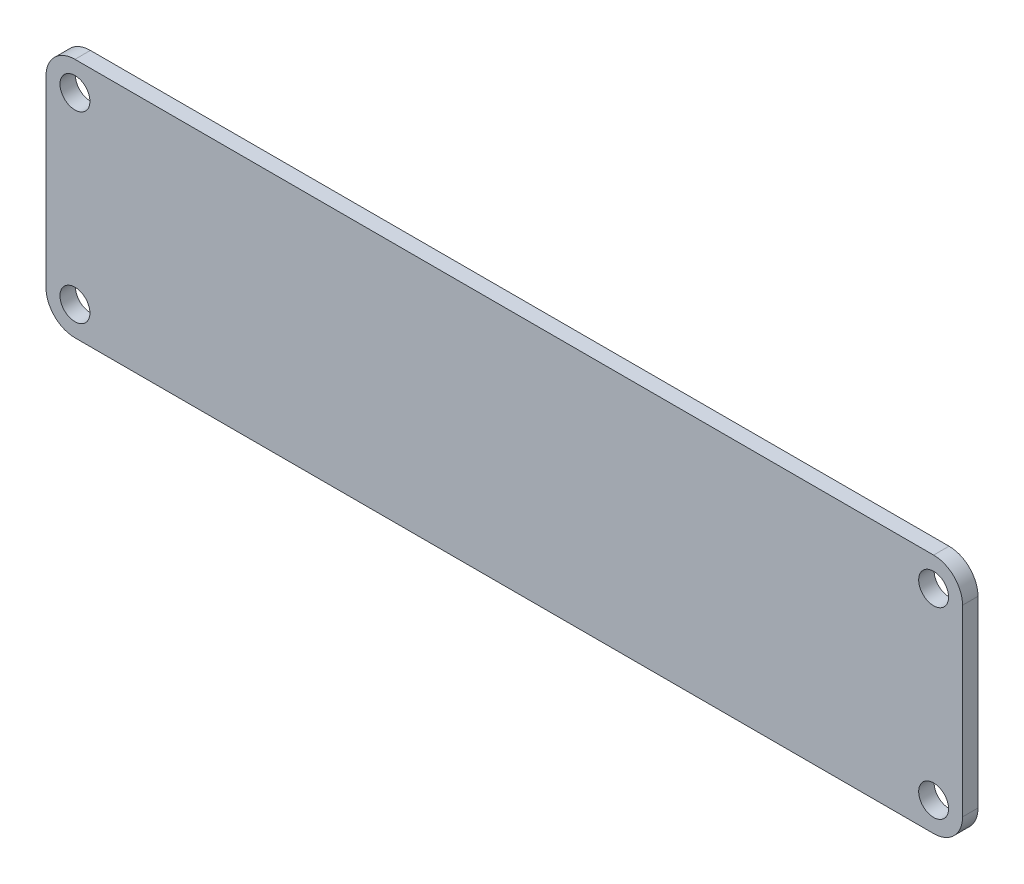
ISO-10303-21;
HEADER;
FILE_DESCRIPTION(('STEP AP214'),'2;1');
FILE_NAME('part.step','',(''),(''),'','','');
FILE_SCHEMA(('AUTOMOTIVE_DESIGN { 1 0 10303 214 1 1 1 1 }'));
ENDSEC;
DATA;
#1=APPLICATION_CONTEXT('core data for automotive mechanical design processes');
#2=APPLICATION_PROTOCOL_DEFINITION('international standard','automotive_design',2000,#1);
#3=PRODUCT_CONTEXT('',#1,'mechanical');
#4=PRODUCT('Part','Part','',(#3));
#5=PRODUCT_RELATED_PRODUCT_CATEGORY('part','',(#4));
#6=PRODUCT_DEFINITION_FORMATION('','',#4);
#7=PRODUCT_DEFINITION_CONTEXT('part definition',#1,'design');
#8=PRODUCT_DEFINITION('design','',#6,#7);
#9=PRODUCT_DEFINITION_SHAPE('','',#8);
#10=(LENGTH_UNIT() NAMED_UNIT(*) SI_UNIT(.MILLI.,.METRE.));
#11=(NAMED_UNIT(*) PLANE_ANGLE_UNIT() SI_UNIT($,.RADIAN.));
#12=(NAMED_UNIT(*) SI_UNIT($,.STERADIAN.) SOLID_ANGLE_UNIT());
#13=UNCERTAINTY_MEASURE_WITH_UNIT(LENGTH_MEASURE(1.E-05),#10,'distance_accuracy_value','');
#14=(GEOMETRIC_REPRESENTATION_CONTEXT(3) GLOBAL_UNCERTAINTY_ASSIGNED_CONTEXT((#13)) GLOBAL_UNIT_ASSIGNED_CONTEXT((#10,
#11,#12)) REPRESENTATION_CONTEXT('',''));
#15=CARTESIAN_POINT('',(0.,0.,0.));
#16=DIRECTION('',(0.,0.,1.));
#17=DIRECTION('',(1.,0.,0.));
#18=AXIS2_PLACEMENT_3D('',#15,#16,#17);
#19=CARTESIAN_POINT('',(44.5,-9.5,1.6));
#20=DIRECTION('',(0.,0.,1.));
#21=DIRECTION('',(1.,0.,0.));
#22=AXIS2_PLACEMENT_3D('',#19,#20,#21);
#23=PLANE('',#22);
#24=CARTESIAN_POINT('',(44.5,-9.5,1.6));
#25=DIRECTION('',(0.,0.,1.));
#26=DIRECTION('',(1.,0.,0.));
#27=AXIS2_PLACEMENT_3D('',#24,#25,#26);
#28=CIRCLE('',#27,1.55);
#29=CARTESIAN_POINT('',(46.05,-9.5,1.6));
#30=VERTEX_POINT('',#29);
#31=EDGE_CURVE('E191',#30,#30,#28,.T.);
#32=ORIENTED_EDGE('',*,*,#31,.F.);
#33=EDGE_LOOP('',(#32));
#34=FACE_BOUND('',#33,.T.);
#35=CARTESIAN_POINT('',(-44.5,9.5,1.6));
#36=DIRECTION('',(0.,0.,1.));
#37=DIRECTION('',(1.,0.,0.));
#38=AXIS2_PLACEMENT_3D('',#35,#36,#37);
#39=CIRCLE('',#38,1.55);
#40=CARTESIAN_POINT('',(-42.95,9.5,1.6));
#41=VERTEX_POINT('',#40);
#42=EDGE_CURVE('E137',#41,#41,#39,.T.);
#43=ORIENTED_EDGE('',*,*,#42,.F.);
#44=EDGE_LOOP('',(#43));
#45=FACE_BOUND('',#44,.T.);
#46=CARTESIAN_POINT('',(44.5,-9.5,1.6));
#47=DIRECTION('',(0.,0.,1.));
#48=DIRECTION('',(1.,0.,0.));
#49=AXIS2_PLACEMENT_3D('',#46,#47,#48);
#50=CIRCLE('',#49,3.);
#51=CARTESIAN_POINT('',(44.5,-12.5,1.6));
#52=VERTEX_POINT('',#51);
#53=CARTESIAN_POINT('',(47.5,-9.5,1.6));
#54=VERTEX_POINT('',#53);
#55=EDGE_CURVE('E148',#52,#54,#50,.T.);
#56=ORIENTED_EDGE('',*,*,#55,.T.);
#57=DIRECTION('',(0.,1.,0.));
#58=VECTOR('',#57,1.);
#59=CARTESIAN_POINT('',(47.5,9.5,1.6));
#60=LINE('',#59,#58);
#61=CARTESIAN_POINT('',(47.5,9.5,1.6));
#62=VERTEX_POINT('',#61);
#63=EDGE_CURVE('E96',#54,#62,#60,.T.);
#64=ORIENTED_EDGE('',*,*,#63,.T.);
#65=CARTESIAN_POINT('',(44.5,9.5,1.6));
#66=DIRECTION('',(0.,0.,1.));
#67=DIRECTION('',(-1.,0.,0.));
#68=AXIS2_PLACEMENT_3D('',#65,#66,#67);
#69=CIRCLE('',#68,3.);
#70=CARTESIAN_POINT('',(44.5,12.5,1.6));
#71=VERTEX_POINT('',#70);
#72=EDGE_CURVE('E163',#62,#71,#69,.T.);
#73=ORIENTED_EDGE('',*,*,#72,.T.);
#74=DIRECTION('',(-1.,0.,0.));
#75=VECTOR('',#74,1.);
#76=CARTESIAN_POINT('',(-44.5,12.5,1.6));
#77=LINE('',#76,#75);
#78=CARTESIAN_POINT('',(-44.5,12.5,1.6));
#79=VERTEX_POINT('',#78);
#80=EDGE_CURVE('E176',#71,#79,#77,.T.);
#81=ORIENTED_EDGE('',*,*,#80,.T.);
#82=CARTESIAN_POINT('',(-44.5,9.5,1.6));
#83=DIRECTION('',(0.,0.,1.));
#84=DIRECTION('',(1.,0.,0.));
#85=AXIS2_PLACEMENT_3D('',#82,#83,#84);
#86=CIRCLE('',#85,3.);
#87=CARTESIAN_POINT('',(-47.5,9.5,1.6));
#88=VERTEX_POINT('',#87);
#89=EDGE_CURVE('E115',#79,#88,#86,.T.);
#90=ORIENTED_EDGE('',*,*,#89,.T.);
#91=DIRECTION('',(0.,-1.,0.));
#92=VECTOR('',#91,1.);
#93=CARTESIAN_POINT('',(-47.5,9.5,1.6));
#94=LINE('',#93,#92);
#95=CARTESIAN_POINT('',(-47.5,-9.5,1.6));
#96=VERTEX_POINT('',#95);
#97=EDGE_CURVE('E109',#88,#96,#94,.T.);
#98=ORIENTED_EDGE('',*,*,#97,.T.);
#99=CARTESIAN_POINT('',(-44.5,-9.5,1.6));
#100=DIRECTION('',(0.,0.,1.));
#101=DIRECTION('',(1.,0.,0.));
#102=AXIS2_PLACEMENT_3D('',#99,#100,#101);
#103=CIRCLE('',#102,3.);
#104=CARTESIAN_POINT('',(-44.5,-12.5,1.6));
#105=VERTEX_POINT('',#104);
#106=EDGE_CURVE('E113',#96,#105,#103,.T.);
#107=ORIENTED_EDGE('',*,*,#106,.T.);
#108=DIRECTION('',(1.,0.,0.));
#109=VECTOR('',#108,1.);
#110=CARTESIAN_POINT('',(-44.5,-12.5,1.6));
#111=LINE('',#110,#109);
#112=EDGE_CURVE('E53',#105,#52,#111,.T.);
#113=ORIENTED_EDGE('',*,*,#112,.T.);
#114=EDGE_LOOP('',(#56,#64,#73,#81,#90,#98,#107,#113));
#115=FACE_BOUND('',#114,.T.);
#116=CARTESIAN_POINT('',(-44.5,-9.5,1.6));
#117=DIRECTION('',(0.,0.,1.));
#118=DIRECTION('',(1.,0.,0.));
#119=AXIS2_PLACEMENT_3D('',#116,#117,#118);
#120=CIRCLE('',#119,1.55);
#121=CARTESIAN_POINT('',(-42.95,-9.5,1.6));
#122=VERTEX_POINT('',#121);
#123=EDGE_CURVE('E185',#122,#122,#120,.T.);
#124=ORIENTED_EDGE('',*,*,#123,.F.);
#125=EDGE_LOOP('',(#124));
#126=FACE_BOUND('',#125,.T.);
#127=CARTESIAN_POINT('',(44.5,9.5,1.6));
#128=DIRECTION('',(0.,0.,1.));
#129=DIRECTION('',(1.,0.,0.));
#130=AXIS2_PLACEMENT_3D('',#127,#128,#129);
#131=CIRCLE('',#130,1.55);
#132=CARTESIAN_POINT('',(46.05,9.5,1.6));
#133=VERTEX_POINT('',#132);
#134=EDGE_CURVE('E197',#133,#133,#131,.T.);
#135=ORIENTED_EDGE('',*,*,#134,.F.);
#136=EDGE_LOOP('',(#135));
#137=FACE_BOUND('',#136,.T.);
#138=ADVANCED_FACE('F36',(#34,#45,#115,#126,#137),#23,.T.);
#139=CARTESIAN_POINT('',(44.5,-9.5,0.));
#140=DIRECTION('',(0.,0.,1.));
#141=DIRECTION('',(1.,0.,0.));
#142=AXIS2_PLACEMENT_3D('',#139,#140,#141);
#143=PLANE('',#142);
#144=CARTESIAN_POINT('',(44.5,-9.5,0.));
#145=DIRECTION('',(0.,0.,1.));
#146=DIRECTION('',(1.,0.,0.));
#147=AXIS2_PLACEMENT_3D('',#144,#145,#146);
#148=CIRCLE('',#147,3.);
#149=CARTESIAN_POINT('',(44.5,-12.5,0.));
#150=VERTEX_POINT('',#149);
#151=CARTESIAN_POINT('',(47.5,-9.5,0.));
#152=VERTEX_POINT('',#151);
#153=EDGE_CURVE('E133',#150,#152,#148,.T.);
#154=ORIENTED_EDGE('',*,*,#153,.F.);
#155=DIRECTION('',(1.,0.,0.));
#156=VECTOR('',#155,1.);
#157=CARTESIAN_POINT('',(-44.5,-12.5,0.));
#158=LINE('',#157,#156);
#159=CARTESIAN_POINT('',(-44.5,-12.5,0.));
#160=VERTEX_POINT('',#159);
#161=EDGE_CURVE('E88',#160,#150,#158,.T.);
#162=ORIENTED_EDGE('',*,*,#161,.F.);
#163=CARTESIAN_POINT('',(-44.5,-9.5,0.));
#164=DIRECTION('',(0.,0.,1.));
#165=DIRECTION('',(1.,0.,0.));
#166=AXIS2_PLACEMENT_3D('',#163,#164,#165);
#167=CIRCLE('',#166,3.);
#168=CARTESIAN_POINT('',(-47.5,-9.5,0.));
#169=VERTEX_POINT('',#168);
#170=EDGE_CURVE('E82',#169,#160,#167,.T.);
#171=ORIENTED_EDGE('',*,*,#170,.F.);
#172=DIRECTION('',(0.,-1.,0.));
#173=VECTOR('',#172,1.);
#174=CARTESIAN_POINT('',(-47.5,9.5,0.));
#175=LINE('',#174,#173);
#176=CARTESIAN_POINT('',(-47.5,9.5,0.));
#177=VERTEX_POINT('',#176);
#178=EDGE_CURVE('E123',#177,#169,#175,.T.);
#179=ORIENTED_EDGE('',*,*,#178,.F.);
#180=CARTESIAN_POINT('',(-44.5,9.5,0.));
#181=DIRECTION('',(0.,0.,1.));
#182=DIRECTION('',(1.,0.,0.));
#183=AXIS2_PLACEMENT_3D('',#180,#181,#182);
#184=CIRCLE('',#183,3.);
#185=CARTESIAN_POINT('',(-44.5,12.5,0.));
#186=VERTEX_POINT('',#185);
#187=EDGE_CURVE('E143',#186,#177,#184,.T.);
#188=ORIENTED_EDGE('',*,*,#187,.F.);
#189=DIRECTION('',(-1.,0.,0.));
#190=VECTOR('',#189,1.);
#191=CARTESIAN_POINT('',(-44.5,12.5,0.));
#192=LINE('',#191,#190);
#193=CARTESIAN_POINT('',(44.5,12.5,0.));
#194=VERTEX_POINT('',#193);
#195=EDGE_CURVE('E141',#194,#186,#192,.T.);
#196=ORIENTED_EDGE('',*,*,#195,.F.);
#197=CARTESIAN_POINT('',(44.5,9.5,0.));
#198=DIRECTION('',(0.,0.,1.));
#199=DIRECTION('',(-1.,0.,0.));
#200=AXIS2_PLACEMENT_3D('',#197,#198,#199);
#201=CIRCLE('',#200,3.);
#202=CARTESIAN_POINT('',(47.5,9.5,0.));
#203=VERTEX_POINT('',#202);
#204=EDGE_CURVE('E139',#203,#194,#201,.T.);
#205=ORIENTED_EDGE('',*,*,#204,.F.);
#206=DIRECTION('',(0.,1.,0.));
#207=VECTOR('',#206,1.);
#208=CARTESIAN_POINT('',(47.5,9.5,0.));
#209=LINE('',#208,#207);
#210=EDGE_CURVE('E136',#152,#203,#209,.T.);
#211=ORIENTED_EDGE('',*,*,#210,.F.);
#212=EDGE_LOOP('',(#154,#162,#171,#179,#188,#196,#205,#211));
#213=FACE_BOUND('',#212,.T.);
#214=CARTESIAN_POINT('',(-44.5,9.5,0.));
#215=DIRECTION('',(0.,0.,1.));
#216=DIRECTION('',(1.,0.,0.));
#217=AXIS2_PLACEMENT_3D('',#214,#215,#216);
#218=CIRCLE('',#217,1.55);
#219=CARTESIAN_POINT('',(-42.95,9.5,0.));
#220=VERTEX_POINT('',#219);
#221=EDGE_CURVE('E182',#220,#220,#218,.T.);
#222=ORIENTED_EDGE('',*,*,#221,.T.);
#223=EDGE_LOOP('',(#222));
#224=FACE_BOUND('',#223,.T.);
#225=CARTESIAN_POINT('',(-44.5,-9.5,0.));
#226=DIRECTION('',(0.,0.,1.));
#227=DIRECTION('',(1.,0.,0.));
#228=AXIS2_PLACEMENT_3D('',#225,#226,#227);
#229=CIRCLE('',#228,1.55);
#230=CARTESIAN_POINT('',(-42.95,-9.5,0.));
#231=VERTEX_POINT('',#230);
#232=EDGE_CURVE('E188',#231,#231,#229,.T.);
#233=ORIENTED_EDGE('',*,*,#232,.T.);
#234=EDGE_LOOP('',(#233));
#235=FACE_BOUND('',#234,.T.);
#236=CARTESIAN_POINT('',(44.5,-9.5,0.));
#237=DIRECTION('',(0.,0.,1.));
#238=DIRECTION('',(1.,0.,0.));
#239=AXIS2_PLACEMENT_3D('',#236,#237,#238);
#240=CIRCLE('',#239,1.55);
#241=CARTESIAN_POINT('',(46.05,-9.5,0.));
#242=VERTEX_POINT('',#241);
#243=EDGE_CURVE('E194',#242,#242,#240,.T.);
#244=ORIENTED_EDGE('',*,*,#243,.T.);
#245=EDGE_LOOP('',(#244));
#246=FACE_BOUND('',#245,.T.);
#247=CARTESIAN_POINT('',(44.5,9.5,0.));
#248=DIRECTION('',(0.,0.,1.));
#249=DIRECTION('',(1.,0.,0.));
#250=AXIS2_PLACEMENT_3D('',#247,#248,#249);
#251=CIRCLE('',#250,1.55);
#252=CARTESIAN_POINT('',(46.05,9.5,0.));
#253=VERTEX_POINT('',#252);
#254=EDGE_CURVE('E200',#253,#253,#251,.T.);
#255=ORIENTED_EDGE('',*,*,#254,.T.);
#256=EDGE_LOOP('',(#255));
#257=FACE_BOUND('',#256,.T.);
#258=ADVANCED_FACE('F167',(#213,#224,#235,#246,#257),#143,.F.);
#259=CARTESIAN_POINT('',(44.5,-9.5,1.6));
#260=DIRECTION('',(0.,0.,-1.));
#261=DIRECTION('',(-1.,0.,0.));
#262=AXIS2_PLACEMENT_3D('',#259,#260,#261);
#263=CYLINDRICAL_SURFACE('',#262,3.);
#264=ORIENTED_EDGE('',*,*,#153,.T.);
#265=DIRECTION('',(0.,0.,-1.));
#266=VECTOR('',#265,1.);
#267=CARTESIAN_POINT('',(47.5,-9.5,1.6));
#268=LINE('',#267,#266);
#269=EDGE_CURVE('E11',#54,#152,#268,.T.);
#270=ORIENTED_EDGE('',*,*,#269,.F.);
#271=ORIENTED_EDGE('',*,*,#55,.F.);
#272=DIRECTION('',(0.,0.,-1.));
#273=VECTOR('',#272,1.);
#274=CARTESIAN_POINT('',(44.5,-12.5,1.6));
#275=LINE('',#274,#273);
#276=EDGE_CURVE('E129',#52,#150,#275,.T.);
#277=ORIENTED_EDGE('',*,*,#276,.T.);
#278=EDGE_LOOP('',(#264,#270,#271,#277));
#279=FACE_BOUND('',#278,.T.);
#280=ADVANCED_FACE('F38',(#279),#263,.T.);
#281=CARTESIAN_POINT('',(47.5,9.5,1.6));
#282=DIRECTION('',(-1.,0.,0.));
#283=DIRECTION('',(0.,-1.,0.));
#284=AXIS2_PLACEMENT_3D('',#281,#282,#283);
#285=PLANE('',#284);
#286=ORIENTED_EDGE('',*,*,#210,.T.);
#287=DIRECTION('',(0.,0.,-1.));
#288=VECTOR('',#287,1.);
#289=CARTESIAN_POINT('',(47.5,9.5,1.6));
#290=LINE('',#289,#288);
#291=EDGE_CURVE('E45',#62,#203,#290,.T.);
#292=ORIENTED_EDGE('',*,*,#291,.F.);
#293=ORIENTED_EDGE('',*,*,#63,.F.);
#294=ORIENTED_EDGE('',*,*,#269,.T.);
#295=EDGE_LOOP('',(#286,#292,#293,#294));
#296=FACE_BOUND('',#295,.T.);
#297=ADVANCED_FACE('F234',(#296),#285,.F.);
#298=CARTESIAN_POINT('',(44.5,9.5,1.6));
#299=DIRECTION('',(0.,0.,-1.));
#300=DIRECTION('',(-1.,0.,0.));
#301=AXIS2_PLACEMENT_3D('',#298,#299,#300);
#302=CYLINDRICAL_SURFACE('',#301,3.);
#303=ORIENTED_EDGE('',*,*,#204,.T.);
#304=DIRECTION('',(0.,0.,-1.));
#305=VECTOR('',#304,1.);
#306=CARTESIAN_POINT('',(44.5,12.5,1.6));
#307=LINE('',#306,#305);
#308=EDGE_CURVE('E155',#71,#194,#307,.T.);
#309=ORIENTED_EDGE('',*,*,#308,.F.);
#310=ORIENTED_EDGE('',*,*,#72,.F.);
#311=ORIENTED_EDGE('',*,*,#291,.T.);
#312=EDGE_LOOP('',(#303,#309,#310,#311));
#313=FACE_BOUND('',#312,.T.);
#314=ADVANCED_FACE('F161',(#313),#302,.T.);
#315=CARTESIAN_POINT('',(-44.5,12.5,1.6));
#316=DIRECTION('',(0.,-1.,0.));
#317=DIRECTION('',(0.,0.,-1.));
#318=AXIS2_PLACEMENT_3D('',#315,#316,#317);
#319=PLANE('',#318);
#320=ORIENTED_EDGE('',*,*,#195,.T.);
#321=DIRECTION('',(0.,0.,-1.));
#322=VECTOR('',#321,1.);
#323=CARTESIAN_POINT('',(-44.5,12.5,1.6));
#324=LINE('',#323,#322);
#325=EDGE_CURVE('E152',#79,#186,#324,.T.);
#326=ORIENTED_EDGE('',*,*,#325,.F.);
#327=ORIENTED_EDGE('',*,*,#80,.F.);
#328=ORIENTED_EDGE('',*,*,#308,.T.);
#329=EDGE_LOOP('',(#320,#326,#327,#328));
#330=FACE_BOUND('',#329,.T.);
#331=ADVANCED_FACE('F172',(#330),#319,.F.);
#332=CARTESIAN_POINT('',(-44.5,9.5,1.6));
#333=DIRECTION('',(0.,0.,-1.));
#334=DIRECTION('',(-1.,0.,0.));
#335=AXIS2_PLACEMENT_3D('',#332,#333,#334);
#336=CYLINDRICAL_SURFACE('',#335,3.);
#337=ORIENTED_EDGE('',*,*,#187,.T.);
#338=DIRECTION('',(0.,0.,-1.));
#339=VECTOR('',#338,1.);
#340=CARTESIAN_POINT('',(-47.5,9.5,1.6));
#341=LINE('',#340,#339);
#342=EDGE_CURVE('E124',#88,#177,#341,.T.);
#343=ORIENTED_EDGE('',*,*,#342,.F.);
#344=ORIENTED_EDGE('',*,*,#89,.F.);
#345=ORIENTED_EDGE('',*,*,#325,.T.);
#346=EDGE_LOOP('',(#337,#343,#344,#345));
#347=FACE_BOUND('',#346,.T.);
#348=ADVANCED_FACE('F175',(#347),#336,.T.);
#349=CARTESIAN_POINT('',(-47.5,9.5,1.6));
#350=DIRECTION('',(1.,0.,0.));
#351=DIRECTION('',(0.,0.,-1.));
#352=AXIS2_PLACEMENT_3D('',#349,#350,#351);
#353=PLANE('',#352);
#354=ORIENTED_EDGE('',*,*,#178,.T.);
#355=DIRECTION('',(0.,0.,-1.));
#356=VECTOR('',#355,1.);
#357=CARTESIAN_POINT('',(-47.5,-9.5,1.6));
#358=LINE('',#357,#356);
#359=EDGE_CURVE('E120',#96,#169,#358,.T.);
#360=ORIENTED_EDGE('',*,*,#359,.F.);
#361=ORIENTED_EDGE('',*,*,#97,.F.);
#362=ORIENTED_EDGE('',*,*,#342,.T.);
#363=EDGE_LOOP('',(#354,#360,#361,#362));
#364=FACE_BOUND('',#363,.T.);
#365=ADVANCED_FACE('F121',(#364),#353,.F.);
#366=CARTESIAN_POINT('',(-44.5,-9.5,1.6));
#367=DIRECTION('',(0.,0.,-1.));
#368=DIRECTION('',(-1.,0.,0.));
#369=AXIS2_PLACEMENT_3D('',#366,#367,#368);
#370=CYLINDRICAL_SURFACE('',#369,3.);
#371=ORIENTED_EDGE('',*,*,#170,.T.);
#372=DIRECTION('',(0.,0.,-1.));
#373=VECTOR('',#372,1.);
#374=CARTESIAN_POINT('',(-44.5,-12.5,1.6));
#375=LINE('',#374,#373);
#376=EDGE_CURVE('E125',#105,#160,#375,.T.);
#377=ORIENTED_EDGE('',*,*,#376,.F.);
#378=ORIENTED_EDGE('',*,*,#106,.F.);
#379=ORIENTED_EDGE('',*,*,#359,.T.);
#380=EDGE_LOOP('',(#371,#377,#378,#379));
#381=FACE_BOUND('',#380,.T.);
#382=ADVANCED_FACE('F127',(#381),#370,.T.);
#383=CARTESIAN_POINT('',(-44.5,-12.5,1.6));
#384=DIRECTION('',(0.,1.,0.));
#385=DIRECTION('',(0.,0.,1.));
#386=AXIS2_PLACEMENT_3D('',#383,#384,#385);
#387=PLANE('',#386);
#388=ORIENTED_EDGE('',*,*,#161,.T.);
#389=ORIENTED_EDGE('',*,*,#276,.F.);
#390=ORIENTED_EDGE('',*,*,#112,.F.);
#391=ORIENTED_EDGE('',*,*,#376,.T.);
#392=EDGE_LOOP('',(#388,#389,#390,#391));
#393=FACE_BOUND('',#392,.T.);
#394=ADVANCED_FACE('F222',(#393),#387,.F.);
#395=CARTESIAN_POINT('',(-44.5,9.5,1.6));
#396=DIRECTION('',(0.,0.,-1.));
#397=DIRECTION('',(-1.,0.,0.));
#398=AXIS2_PLACEMENT_3D('',#395,#396,#397);
#399=CYLINDRICAL_SURFACE('',#398,1.55);
#400=ORIENTED_EDGE('',*,*,#42,.T.);
#401=EDGE_LOOP('',(#400));
#402=FACE_BOUND('',#401,.T.);
#403=ORIENTED_EDGE('',*,*,#221,.F.);
#404=EDGE_LOOP('',(#403));
#405=FACE_BOUND('',#404,.T.);
#406=ADVANCED_FACE('F219',(#402,#405),#399,.F.);
#407=CARTESIAN_POINT('',(-44.5,-9.5,1.6));
#408=DIRECTION('',(0.,0.,-1.));
#409=DIRECTION('',(-1.,0.,0.));
#410=AXIS2_PLACEMENT_3D('',#407,#408,#409);
#411=CYLINDRICAL_SURFACE('',#410,1.55);
#412=ORIENTED_EDGE('',*,*,#123,.T.);
#413=EDGE_LOOP('',(#412));
#414=FACE_BOUND('',#413,.T.);
#415=ORIENTED_EDGE('',*,*,#232,.F.);
#416=EDGE_LOOP('',(#415));
#417=FACE_BOUND('',#416,.T.);
#418=ADVANCED_FACE('F298',(#414,#417),#411,.F.);
#419=CARTESIAN_POINT('',(44.5,-9.5,1.6));
#420=DIRECTION('',(0.,0.,-1.));
#421=DIRECTION('',(-1.,0.,0.));
#422=AXIS2_PLACEMENT_3D('',#419,#420,#421);
#423=CYLINDRICAL_SURFACE('',#422,1.55);
#424=ORIENTED_EDGE('',*,*,#31,.T.);
#425=EDGE_LOOP('',(#424));
#426=FACE_BOUND('',#425,.T.);
#427=ORIENTED_EDGE('',*,*,#243,.F.);
#428=EDGE_LOOP('',(#427));
#429=FACE_BOUND('',#428,.T.);
#430=ADVANCED_FACE('F306',(#426,#429),#423,.F.);
#431=CARTESIAN_POINT('',(44.5,9.5,1.6));
#432=DIRECTION('',(0.,0.,-1.));
#433=DIRECTION('',(-1.,0.,0.));
#434=AXIS2_PLACEMENT_3D('',#431,#432,#433);
#435=CYLINDRICAL_SURFACE('',#434,1.55);
#436=ORIENTED_EDGE('',*,*,#134,.T.);
#437=EDGE_LOOP('',(#436));
#438=FACE_BOUND('',#437,.T.);
#439=ORIENTED_EDGE('',*,*,#254,.F.);
#440=EDGE_LOOP('',(#439));
#441=FACE_BOUND('',#440,.T.);
#442=ADVANCED_FACE('F206',(#438,#441),#435,.F.);
#443=CLOSED_SHELL('',(#138,#258,#280,#297,#314,#331,#348,#365,#382,#394,#406,#418,#430,#442));
#444=MANIFOLD_SOLID_BREP('B2',#443);
#445=ADVANCED_BREP_SHAPE_REPRESENTATION('',(#18,#444),#14);
#446=SHAPE_DEFINITION_REPRESENTATION(#9,#445);
ENDSEC;
END-ISO-10303-21;
